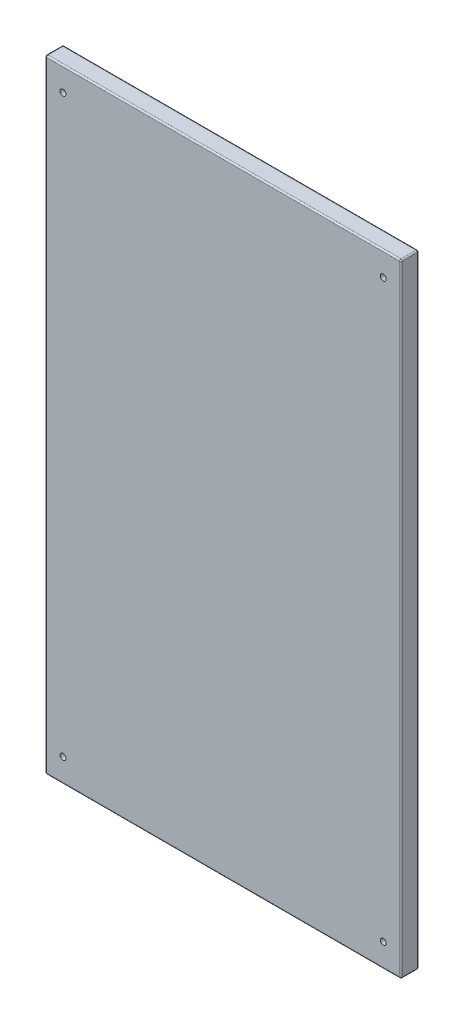
ISO-10303-21;
HEADER;
FILE_DESCRIPTION(('STEP AP214'),'2;1');
FILE_NAME('part.step','',(''),(''),'','','');
FILE_SCHEMA(('AUTOMOTIVE_DESIGN { 1 0 10303 214 1 1 1 1 }'));
ENDSEC;
DATA;
#1=APPLICATION_CONTEXT('core data for automotive mechanical design processes');
#2=APPLICATION_PROTOCOL_DEFINITION('international standard','automotive_design',2000,#1);
#3=PRODUCT_CONTEXT('',#1,'mechanical');
#4=PRODUCT('Part','Part','',(#3));
#5=PRODUCT_RELATED_PRODUCT_CATEGORY('part','',(#4));
#6=PRODUCT_DEFINITION_FORMATION('','',#4);
#7=PRODUCT_DEFINITION_CONTEXT('part definition',#1,'design');
#8=PRODUCT_DEFINITION('design','',#6,#7);
#9=PRODUCT_DEFINITION_SHAPE('','',#8);
#10=(LENGTH_UNIT() NAMED_UNIT(*) SI_UNIT(.MILLI.,.METRE.));
#11=(NAMED_UNIT(*) PLANE_ANGLE_UNIT() SI_UNIT($,.RADIAN.));
#12=(NAMED_UNIT(*) SI_UNIT($,.STERADIAN.) SOLID_ANGLE_UNIT());
#13=UNCERTAINTY_MEASURE_WITH_UNIT(LENGTH_MEASURE(1.E-05),#10,'distance_accuracy_value','');
#14=(GEOMETRIC_REPRESENTATION_CONTEXT(3) GLOBAL_UNCERTAINTY_ASSIGNED_CONTEXT((#13)) GLOBAL_UNIT_ASSIGNED_CONTEXT((#10,
#11,#12)) REPRESENTATION_CONTEXT('',''));
#15=CARTESIAN_POINT('',(0.,0.,0.));
#16=DIRECTION('',(0.,0.,1.));
#17=DIRECTION('',(1.,0.,0.));
#18=AXIS2_PLACEMENT_3D('',#15,#16,#17);
#19=CARTESIAN_POINT('',(-120.,105.,6.));
#20=DIRECTION('',(1.,0.,0.));
#21=DIRECTION('',(0.,0.,-1.));
#22=AXIS2_PLACEMENT_3D('',#19,#20,#21);
#23=PLANE('',#22);
#24=DIRECTION('',(0.,-1.,0.));
#25=VECTOR('',#24,1.);
#26=CARTESIAN_POINT('',(-120.,105.,0.5));
#27=LINE('',#26,#25);
#28=CARTESIAN_POINT('',(-120.,104.5,0.5));
#29=VERTEX_POINT('',#28);
#30=CARTESIAN_POINT('',(-120.,-104.5,0.5));
#31=VERTEX_POINT('',#30);
#32=EDGE_CURVE('E202',#29,#31,#27,.T.);
#33=ORIENTED_EDGE('',*,*,#32,.T.);
#34=DIRECTION('',(0.,0.,-1.));
#35=VECTOR('',#34,1.);
#36=CARTESIAN_POINT('',(-120.,-104.5,6.));
#37=LINE('',#36,#35);
#38=CARTESIAN_POINT('',(-120.,-104.5,5.5));
#39=VERTEX_POINT('',#38);
#40=EDGE_CURVE('E204',#31,#39,#37,.F.);
#41=ORIENTED_EDGE('',*,*,#40,.T.);
#42=DIRECTION('',(0.,-1.,0.));
#43=VECTOR('',#42,1.);
#44=CARTESIAN_POINT('',(-120.,105.,5.5));
#45=LINE('',#44,#43);
#46=CARTESIAN_POINT('',(-120.,104.5,5.5));
#47=VERTEX_POINT('',#46);
#48=EDGE_CURVE('E200',#39,#47,#45,.F.);
#49=ORIENTED_EDGE('',*,*,#48,.T.);
#50=DIRECTION('',(0.,0.,-1.));
#51=VECTOR('',#50,1.);
#52=CARTESIAN_POINT('',(-120.,104.5,6.));
#53=LINE('',#52,#51);
#54=EDGE_CURVE('E198',#47,#29,#53,.T.);
#55=ORIENTED_EDGE('',*,*,#54,.T.);
#56=EDGE_LOOP('',(#33,#41,#49,#55));
#57=FACE_BOUND('',#56,.T.);
#58=ADVANCED_FACE('F36',(#57),#23,.F.);
#59=CARTESIAN_POINT('',(-120.,-105.,6.));
#60=DIRECTION('',(0.,1.,0.));
#61=DIRECTION('',(0.,0.,1.));
#62=AXIS2_PLACEMENT_3D('',#59,#60,#61);
#63=PLANE('',#62);
#64=DIRECTION('',(1.,0.,0.));
#65=VECTOR('',#64,1.);
#66=CARTESIAN_POINT('',(-120.,-105.,0.5));
#67=LINE('',#66,#65);
#68=CARTESIAN_POINT('',(-119.5,-105.,0.5));
#69=VERTEX_POINT('',#68);
#70=CARTESIAN_POINT('',(-0.499999999999986,-105.,0.5));
#71=VERTEX_POINT('',#70);
#72=EDGE_CURVE('E175',#69,#71,#67,.T.);
#73=ORIENTED_EDGE('',*,*,#72,.T.);
#74=DIRECTION('',(0.,0.,-1.));
#75=VECTOR('',#74,1.);
#76=CARTESIAN_POINT('',(-0.499999999999987,-105.,6.));
#77=LINE('',#76,#75);
#78=CARTESIAN_POINT('',(-0.499999999999986,-105.,5.5));
#79=VERTEX_POINT('',#78);
#80=EDGE_CURVE('E177',#71,#79,#77,.F.);
#81=ORIENTED_EDGE('',*,*,#80,.T.);
#82=DIRECTION('',(1.,0.,0.));
#83=VECTOR('',#82,1.);
#84=CARTESIAN_POINT('',(-120.,-105.,5.5));
#85=LINE('',#84,#83);
#86=CARTESIAN_POINT('',(-119.5,-105.,5.5));
#87=VERTEX_POINT('',#86);
#88=EDGE_CURVE('E173',#79,#87,#85,.F.);
#89=ORIENTED_EDGE('',*,*,#88,.T.);
#90=DIRECTION('',(0.,0.,-1.));
#91=VECTOR('',#90,1.);
#92=CARTESIAN_POINT('',(-119.5,-105.,6.));
#93=LINE('',#92,#91);
#94=EDGE_CURVE('E171',#87,#69,#93,.T.);
#95=ORIENTED_EDGE('',*,*,#94,.T.);
#96=EDGE_LOOP('',(#73,#81,#89,#95));
#97=FACE_BOUND('',#96,.T.);
#98=ADVANCED_FACE('F330',(#97),#63,.F.);
#99=CARTESIAN_POINT('',(0.,105.,6.));
#100=DIRECTION('',(-1.,0.,0.));
#101=DIRECTION('',(0.,0.,1.));
#102=AXIS2_PLACEMENT_3D('',#99,#100,#101);
#103=PLANE('',#102);
#104=DIRECTION('',(0.,0.,-1.));
#105=VECTOR('',#104,1.);
#106=CARTESIAN_POINT('',(0.,-104.5,6.));
#107=LINE('',#106,#105);
#108=CARTESIAN_POINT('',(0.,-104.5,5.5));
#109=VERTEX_POINT('',#108);
#110=CARTESIAN_POINT('',(0.,-104.5,0.5));
#111=VERTEX_POINT('',#110);
#112=EDGE_CURVE('E138',#109,#111,#107,.T.);
#113=ORIENTED_EDGE('',*,*,#112,.T.);
#114=DIRECTION('',(0.,1.,0.));
#115=VECTOR('',#114,1.);
#116=CARTESIAN_POINT('',(0.,105.,0.5));
#117=LINE('',#116,#115);
#118=CARTESIAN_POINT('',(0.,104.5,0.5));
#119=VERTEX_POINT('',#118);
#120=EDGE_CURVE('E134',#111,#119,#117,.T.);
#121=ORIENTED_EDGE('',*,*,#120,.T.);
#122=DIRECTION('',(0.,0.,-1.));
#123=VECTOR('',#122,1.);
#124=CARTESIAN_POINT('',(0.,104.5,6.));
#125=LINE('',#124,#123);
#126=CARTESIAN_POINT('',(0.,104.5,5.5));
#127=VERTEX_POINT('',#126);
#128=EDGE_CURVE('E126',#119,#127,#125,.F.);
#129=ORIENTED_EDGE('',*,*,#128,.T.);
#130=DIRECTION('',(0.,1.,0.));
#131=VECTOR('',#130,1.);
#132=CARTESIAN_POINT('',(0.,-105.,5.5));
#133=LINE('',#132,#131);
#134=EDGE_CURVE('E131',#127,#109,#133,.F.);
#135=ORIENTED_EDGE('',*,*,#134,.T.);
#136=EDGE_LOOP('',(#113,#121,#129,#135));
#137=FACE_BOUND('',#136,.T.);
#138=ADVANCED_FACE('F129',(#137),#103,.F.);
#139=CARTESIAN_POINT('',(-120.,105.,6.));
#140=DIRECTION('',(0.,-1.,0.));
#141=DIRECTION('',(0.,0.,-1.));
#142=AXIS2_PLACEMENT_3D('',#139,#140,#141);
#143=PLANE('',#142);
#144=DIRECTION('',(-1.,0.,0.));
#145=VECTOR('',#144,1.);
#146=CARTESIAN_POINT('',(-120.,105.,0.5));
#147=LINE('',#146,#145);
#148=CARTESIAN_POINT('',(-0.499999999999987,105.,0.5));
#149=VERTEX_POINT('',#148);
#150=CARTESIAN_POINT('',(-119.5,105.,0.5));
#151=VERTEX_POINT('',#150);
#152=EDGE_CURVE('E45',#149,#151,#147,.T.);
#153=ORIENTED_EDGE('',*,*,#152,.T.);
#154=DIRECTION('',(0.,0.,-1.));
#155=VECTOR('',#154,1.);
#156=CARTESIAN_POINT('',(-119.5,105.,6.));
#157=LINE('',#156,#155);
#158=CARTESIAN_POINT('',(-119.5,105.,5.5));
#159=VERTEX_POINT('',#158);
#160=EDGE_CURVE('E11',#151,#159,#157,.F.);
#161=ORIENTED_EDGE('',*,*,#160,.T.);
#162=DIRECTION('',(-1.,0.,0.));
#163=VECTOR('',#162,1.);
#164=CARTESIAN_POINT('',(0.,105.,5.5));
#165=LINE('',#164,#163);
#166=CARTESIAN_POINT('',(-0.499999999999987,105.,5.5));
#167=VERTEX_POINT('',#166);
#168=EDGE_CURVE('E59',#159,#167,#165,.F.);
#169=ORIENTED_EDGE('',*,*,#168,.T.);
#170=DIRECTION('',(0.,0.,-1.));
#171=VECTOR('',#170,1.);
#172=CARTESIAN_POINT('',(-0.499999999999987,105.,6.));
#173=LINE('',#172,#171);
#174=EDGE_CURVE('E145',#167,#149,#173,.T.);
#175=ORIENTED_EDGE('',*,*,#174,.T.);
#176=EDGE_LOOP('',(#153,#161,#169,#175));
#177=FACE_BOUND('',#176,.T.);
#178=ADVANCED_FACE('F413',(#177),#143,.F.);
#179=CARTESIAN_POINT('',(0.,0.,6.));
#180=DIRECTION('',(0.,0.,1.));
#181=DIRECTION('',(1.,0.,0.));
#182=AXIS2_PLACEMENT_3D('',#179,#180,#181);
#183=PLANE('',#182);
#184=DIRECTION('',(0.,-1.,0.));
#185=VECTOR('',#184,1.);
#186=CARTESIAN_POINT('',(-119.5,-105.,6.));
#187=LINE('',#186,#185);
#188=CARTESIAN_POINT('',(-119.5,104.5,6.));
#189=VERTEX_POINT('',#188);
#190=CARTESIAN_POINT('',(-119.5,-104.5,6.));
#191=VERTEX_POINT('',#190);
#192=EDGE_CURVE('E193',#189,#191,#187,.T.);
#193=ORIENTED_EDGE('',*,*,#192,.T.);
#194=DIRECTION('',(1.,0.,0.));
#195=VECTOR('',#194,1.);
#196=CARTESIAN_POINT('',(0.,-104.5,6.));
#197=LINE('',#196,#195);
#198=CARTESIAN_POINT('',(-0.499999999999986,-104.5,6.));
#199=VERTEX_POINT('',#198);
#200=EDGE_CURVE('E195',#191,#199,#197,.T.);
#201=ORIENTED_EDGE('',*,*,#200,.T.);
#202=DIRECTION('',(0.,1.,0.));
#203=VECTOR('',#202,1.);
#204=CARTESIAN_POINT('',(-0.499999999999986,105.,6.));
#205=LINE('',#204,#203);
#206=CARTESIAN_POINT('',(-0.499999999999986,104.5,6.));
#207=VERTEX_POINT('',#206);
#208=EDGE_CURVE('E189',#199,#207,#205,.T.);
#209=ORIENTED_EDGE('',*,*,#208,.T.);
#210=DIRECTION('',(-1.,0.,0.));
#211=VECTOR('',#210,1.);
#212=CARTESIAN_POINT('',(-120.,104.5,6.));
#213=LINE('',#212,#211);
#214=EDGE_CURVE('E191',#207,#189,#213,.T.);
#215=ORIENTED_EDGE('',*,*,#214,.T.);
#216=EDGE_LOOP('',(#193,#201,#209,#215));
#217=FACE_BOUND('',#216,.T.);
#218=CARTESIAN_POINT('',(-114.,-97.,6.));
#219=DIRECTION('',(0.,0.,1.));
#220=DIRECTION('',(1.,0.,0.));
#221=AXIS2_PLACEMENT_3D('',#218,#219,#220);
#222=CIRCLE('',#221,0.999999999999998);
#223=CARTESIAN_POINT('',(-113.,-97.,6.));
#224=VERTEX_POINT('',#223);
#225=EDGE_CURVE('E263',#224,#224,#222,.T.);
#226=ORIENTED_EDGE('',*,*,#225,.F.);
#227=EDGE_LOOP('',(#226));
#228=FACE_BOUND('',#227,.T.);
#229=CARTESIAN_POINT('',(-5.99999999999999,-97.,6.));
#230=DIRECTION('',(0.,0.,1.));
#231=DIRECTION('',(1.,0.,0.));
#232=AXIS2_PLACEMENT_3D('',#229,#230,#231);
#233=CIRCLE('',#232,1.);
#234=CARTESIAN_POINT('',(-4.99999999999998,-97.,6.));
#235=VERTEX_POINT('',#234);
#236=EDGE_CURVE('E273',#235,#235,#233,.T.);
#237=ORIENTED_EDGE('',*,*,#236,.F.);
#238=EDGE_LOOP('',(#237));
#239=FACE_BOUND('',#238,.T.);
#240=CARTESIAN_POINT('',(-5.99999999999999,97.,6.));
#241=DIRECTION('',(0.,0.,1.));
#242=DIRECTION('',(1.,0.,0.));
#243=AXIS2_PLACEMENT_3D('',#240,#241,#242);
#244=CIRCLE('',#243,1.);
#245=CARTESIAN_POINT('',(-4.99999999999998,97.,6.));
#246=VERTEX_POINT('',#245);
#247=EDGE_CURVE('E450',#246,#246,#244,.T.);
#248=ORIENTED_EDGE('',*,*,#247,.F.);
#249=EDGE_LOOP('',(#248));
#250=FACE_BOUND('',#249,.T.);
#251=CARTESIAN_POINT('',(-114.,97.,6.));
#252=DIRECTION('',(0.,0.,1.));
#253=DIRECTION('',(1.,0.,0.));
#254=AXIS2_PLACEMENT_3D('',#251,#252,#253);
#255=CIRCLE('',#254,0.999999999999998);
#256=CARTESIAN_POINT('',(-113.,97.,6.));
#257=VERTEX_POINT('',#256);
#258=EDGE_CURVE('E281',#257,#257,#255,.T.);
#259=ORIENTED_EDGE('',*,*,#258,.F.);
#260=EDGE_LOOP('',(#259));
#261=FACE_BOUND('',#260,.T.);
#262=ADVANCED_FACE('F309',(#217,#228,#239,#250,#261),#183,.T.);
#263=CARTESIAN_POINT('',(0.,0.,0.));
#264=DIRECTION('',(0.,0.,1.));
#265=DIRECTION('',(1.,0.,0.));
#266=AXIS2_PLACEMENT_3D('',#263,#264,#265);
#267=PLANE('',#266);
#268=DIRECTION('',(0.,1.,0.));
#269=VECTOR('',#268,1.);
#270=CARTESIAN_POINT('',(-0.499999999999986,0.,0.));
#271=LINE('',#270,#269);
#272=CARTESIAN_POINT('',(-0.499999999999986,104.5,0.));
#273=VERTEX_POINT('',#272);
#274=CARTESIAN_POINT('',(-0.499999999999986,-104.5,0.));
#275=VERTEX_POINT('',#274);
#276=EDGE_CURVE('E180',#273,#275,#271,.F.);
#277=ORIENTED_EDGE('',*,*,#276,.T.);
#278=DIRECTION('',(1.,0.,0.));
#279=VECTOR('',#278,1.);
#280=CARTESIAN_POINT('',(0.,-104.5,0.));
#281=LINE('',#280,#279);
#282=CARTESIAN_POINT('',(-119.5,-104.5,0.));
#283=VERTEX_POINT('',#282);
#284=EDGE_CURVE('E186',#275,#283,#281,.F.);
#285=ORIENTED_EDGE('',*,*,#284,.T.);
#286=DIRECTION('',(0.,-1.,0.));
#287=VECTOR('',#286,1.);
#288=CARTESIAN_POINT('',(-119.5,0.,0.));
#289=LINE('',#288,#287);
#290=CARTESIAN_POINT('',(-119.5,104.5,0.));
#291=VERTEX_POINT('',#290);
#292=EDGE_CURVE('E184',#283,#291,#289,.F.);
#293=ORIENTED_EDGE('',*,*,#292,.T.);
#294=DIRECTION('',(-1.,0.,0.));
#295=VECTOR('',#294,1.);
#296=CARTESIAN_POINT('',(0.,104.5,0.));
#297=LINE('',#296,#295);
#298=EDGE_CURVE('E182',#291,#273,#297,.F.);
#299=ORIENTED_EDGE('',*,*,#298,.T.);
#300=EDGE_LOOP('',(#277,#285,#293,#299));
#301=FACE_BOUND('',#300,.T.);
#302=CARTESIAN_POINT('',(-114.,97.,0.));
#303=DIRECTION('',(0.,0.,-1.));
#304=DIRECTION('',(-1.,0.,0.));
#305=AXIS2_PLACEMENT_3D('',#302,#303,#304);
#306=CIRCLE('',#305,2.);
#307=CARTESIAN_POINT('',(-116.,97.,0.));
#308=VERTEX_POINT('',#307);
#309=EDGE_CURVE('E294',#308,#308,#306,.T.);
#310=ORIENTED_EDGE('',*,*,#309,.F.);
#311=EDGE_LOOP('',(#310));
#312=FACE_BOUND('',#311,.T.);
#313=CARTESIAN_POINT('',(-5.99999999999999,-97.,0.));
#314=DIRECTION('',(0.,0.,-1.));
#315=DIRECTION('',(-1.,0.,0.));
#316=AXIS2_PLACEMENT_3D('',#313,#314,#315);
#317=CIRCLE('',#316,2.);
#318=CARTESIAN_POINT('',(-7.99999999999999,-97.,0.));
#319=VERTEX_POINT('',#318);
#320=EDGE_CURVE('E288',#319,#319,#317,.T.);
#321=ORIENTED_EDGE('',*,*,#320,.F.);
#322=EDGE_LOOP('',(#321));
#323=FACE_BOUND('',#322,.T.);
#324=CARTESIAN_POINT('',(-114.,-97.,0.));
#325=DIRECTION('',(0.,0.,-1.));
#326=DIRECTION('',(-1.,0.,0.));
#327=AXIS2_PLACEMENT_3D('',#324,#325,#326);
#328=CIRCLE('',#327,2.);
#329=CARTESIAN_POINT('',(-116.,-97.,0.));
#330=VERTEX_POINT('',#329);
#331=EDGE_CURVE('E280',#330,#330,#328,.T.);
#332=ORIENTED_EDGE('',*,*,#331,.F.);
#333=EDGE_LOOP('',(#332));
#334=FACE_BOUND('',#333,.T.);
#335=CARTESIAN_POINT('',(-5.99999999999999,97.,0.));
#336=DIRECTION('',(0.,0.,-1.));
#337=DIRECTION('',(-1.,0.,0.));
#338=AXIS2_PLACEMENT_3D('',#335,#336,#337);
#339=CIRCLE('',#338,2.);
#340=CARTESIAN_POINT('',(-7.99999999999999,97.,0.));
#341=VERTEX_POINT('',#340);
#342=EDGE_CURVE('E165',#341,#341,#339,.T.);
#343=ORIENTED_EDGE('',*,*,#342,.F.);
#344=EDGE_LOOP('',(#343));
#345=FACE_BOUND('',#344,.T.);
#346=ADVANCED_FACE('F305',(#301,#312,#323,#334,#345),#267,.F.);
#347=CARTESIAN_POINT('',(-5.99999999999999,97.,3.));
#348=DIRECTION('',(0.,0.,-1.));
#349=DIRECTION('',(-1.,0.,0.));
#350=AXIS2_PLACEMENT_3D('',#347,#348,#349);
#351=CYLINDRICAL_SURFACE('',#350,2.);
#352=CARTESIAN_POINT('',(-5.99999999999999,97.,3.));
#353=DIRECTION('',(0.,0.,-1.));
#354=DIRECTION('',(-1.,0.,0.));
#355=AXIS2_PLACEMENT_3D('',#352,#353,#354);
#356=CIRCLE('',#355,2.);
#357=CARTESIAN_POINT('',(-7.99999999999999,97.,3.));
#358=VERTEX_POINT('',#357);
#359=EDGE_CURVE('E162',#358,#358,#356,.T.);
#360=ORIENTED_EDGE('',*,*,#359,.F.);
#361=EDGE_LOOP('',(#360));
#362=FACE_BOUND('',#361,.T.);
#363=ORIENTED_EDGE('',*,*,#342,.T.);
#364=EDGE_LOOP('',(#363));
#365=FACE_BOUND('',#364,.T.);
#366=ADVANCED_FACE('F308',(#362,#365),#351,.F.);
#367=CARTESIAN_POINT('',(-5.99999999999999,97.,3.));
#368=DIRECTION('',(0.,0.,-1.));
#369=DIRECTION('',(-1.,0.,0.));
#370=AXIS2_PLACEMENT_3D('',#367,#368,#369);
#371=PLANE('',#370);
#372=CARTESIAN_POINT('',(-5.99999999999999,97.,3.));
#373=DIRECTION('',(0.,0.,1.));
#374=DIRECTION('',(1.,0.,0.));
#375=AXIS2_PLACEMENT_3D('',#372,#373,#374);
#376=CIRCLE('',#375,1.);
#377=CARTESIAN_POINT('',(-4.99999999999998,97.,3.));
#378=VERTEX_POINT('',#377);
#379=EDGE_CURVE('E284',#378,#378,#376,.T.);
#380=ORIENTED_EDGE('',*,*,#379,.T.);
#381=EDGE_LOOP('',(#380));
#382=FACE_BOUND('',#381,.T.);
#383=ORIENTED_EDGE('',*,*,#359,.T.);
#384=EDGE_LOOP('',(#383));
#385=FACE_BOUND('',#384,.T.);
#386=ADVANCED_FACE('F318',(#382,#385),#371,.T.);
#387=CARTESIAN_POINT('',(-114.,-97.,3.));
#388=DIRECTION('',(0.,0.,-1.));
#389=DIRECTION('',(-1.,0.,0.));
#390=AXIS2_PLACEMENT_3D('',#387,#388,#389);
#391=CYLINDRICAL_SURFACE('',#390,2.);
#392=CARTESIAN_POINT('',(-114.,-97.,3.));
#393=DIRECTION('',(0.,0.,-1.));
#394=DIRECTION('',(-1.,0.,0.));
#395=AXIS2_PLACEMENT_3D('',#392,#393,#394);
#396=CIRCLE('',#395,2.);
#397=CARTESIAN_POINT('',(-116.,-97.,3.));
#398=VERTEX_POINT('',#397);
#399=EDGE_CURVE('E285',#398,#398,#396,.T.);
#400=ORIENTED_EDGE('',*,*,#399,.F.);
#401=EDGE_LOOP('',(#400));
#402=FACE_BOUND('',#401,.T.);
#403=ORIENTED_EDGE('',*,*,#331,.T.);
#404=EDGE_LOOP('',(#403));
#405=FACE_BOUND('',#404,.T.);
#406=ADVANCED_FACE('F324',(#402,#405),#391,.F.);
#407=CARTESIAN_POINT('',(-114.,-97.,3.));
#408=DIRECTION('',(0.,0.,-1.));
#409=DIRECTION('',(-1.,0.,0.));
#410=AXIS2_PLACEMENT_3D('',#407,#408,#409);
#411=PLANE('',#410);
#412=CARTESIAN_POINT('',(-114.,-97.,3.));
#413=DIRECTION('',(0.,0.,1.));
#414=DIRECTION('',(1.,0.,0.));
#415=AXIS2_PLACEMENT_3D('',#412,#413,#414);
#416=CIRCLE('',#415,0.999999999999998);
#417=CARTESIAN_POINT('',(-113.,-97.,3.));
#418=VERTEX_POINT('',#417);
#419=EDGE_CURVE('E268',#418,#418,#416,.T.);
#420=ORIENTED_EDGE('',*,*,#419,.T.);
#421=EDGE_LOOP('',(#420));
#422=FACE_BOUND('',#421,.T.);
#423=ORIENTED_EDGE('',*,*,#399,.T.);
#424=EDGE_LOOP('',(#423));
#425=FACE_BOUND('',#424,.T.);
#426=ADVANCED_FACE('F473',(#422,#425),#411,.T.);
#427=CARTESIAN_POINT('',(-5.99999999999999,-97.,3.));
#428=DIRECTION('',(0.,0.,-1.));
#429=DIRECTION('',(-1.,0.,0.));
#430=AXIS2_PLACEMENT_3D('',#427,#428,#429);
#431=CYLINDRICAL_SURFACE('',#430,2.);
#432=CARTESIAN_POINT('',(-5.99999999999999,-97.,3.));
#433=DIRECTION('',(0.,0.,-1.));
#434=DIRECTION('',(-1.,0.,0.));
#435=AXIS2_PLACEMENT_3D('',#432,#433,#434);
#436=CIRCLE('',#435,2.);
#437=CARTESIAN_POINT('',(-7.99999999999999,-97.,3.));
#438=VERTEX_POINT('',#437);
#439=EDGE_CURVE('E297',#438,#438,#436,.T.);
#440=ORIENTED_EDGE('',*,*,#439,.F.);
#441=EDGE_LOOP('',(#440));
#442=FACE_BOUND('',#441,.T.);
#443=ORIENTED_EDGE('',*,*,#320,.T.);
#444=EDGE_LOOP('',(#443));
#445=FACE_BOUND('',#444,.T.);
#446=ADVANCED_FACE('F303',(#442,#445),#431,.F.);
#447=CARTESIAN_POINT('',(-5.99999999999999,-97.,3.));
#448=DIRECTION('',(0.,0.,-1.));
#449=DIRECTION('',(-1.,0.,0.));
#450=AXIS2_PLACEMENT_3D('',#447,#448,#449);
#451=PLANE('',#450);
#452=CARTESIAN_POINT('',(-5.99999999999999,-97.,3.));
#453=DIRECTION('',(0.,0.,1.));
#454=DIRECTION('',(1.,0.,0.));
#455=AXIS2_PLACEMENT_3D('',#452,#453,#454);
#456=CIRCLE('',#455,1.);
#457=CARTESIAN_POINT('',(-4.99999999999998,-97.,3.));
#458=VERTEX_POINT('',#457);
#459=EDGE_CURVE('E725',#458,#458,#456,.T.);
#460=ORIENTED_EDGE('',*,*,#459,.T.);
#461=EDGE_LOOP('',(#460));
#462=FACE_BOUND('',#461,.T.);
#463=ORIENTED_EDGE('',*,*,#439,.T.);
#464=EDGE_LOOP('',(#463));
#465=FACE_BOUND('',#464,.T.);
#466=ADVANCED_FACE('F482',(#462,#465),#451,.T.);
#467=CARTESIAN_POINT('',(-114.,97.,3.));
#468=DIRECTION('',(0.,0.,-1.));
#469=DIRECTION('',(-1.,0.,0.));
#470=AXIS2_PLACEMENT_3D('',#467,#468,#469);
#471=CYLINDRICAL_SURFACE('',#470,2.);
#472=CARTESIAN_POINT('',(-114.,97.,3.));
#473=DIRECTION('',(0.,0.,-1.));
#474=DIRECTION('',(-1.,0.,0.));
#475=AXIS2_PLACEMENT_3D('',#472,#473,#474);
#476=CIRCLE('',#475,2.);
#477=CARTESIAN_POINT('',(-116.,97.,3.));
#478=VERTEX_POINT('',#477);
#479=EDGE_CURVE('E291',#478,#478,#476,.T.);
#480=ORIENTED_EDGE('',*,*,#479,.F.);
#481=EDGE_LOOP('',(#480));
#482=FACE_BOUND('',#481,.T.);
#483=ORIENTED_EDGE('',*,*,#309,.T.);
#484=EDGE_LOOP('',(#483));
#485=FACE_BOUND('',#484,.T.);
#486=ADVANCED_FACE('F466',(#482,#485),#471,.F.);
#487=CARTESIAN_POINT('',(-114.,97.,3.));
#488=DIRECTION('',(0.,0.,-1.));
#489=DIRECTION('',(-1.,0.,0.));
#490=AXIS2_PLACEMENT_3D('',#487,#488,#489);
#491=PLANE('',#490);
#492=CARTESIAN_POINT('',(-114.,97.,3.));
#493=DIRECTION('',(0.,0.,1.));
#494=DIRECTION('',(1.,0.,0.));
#495=AXIS2_PLACEMENT_3D('',#492,#493,#494);
#496=CIRCLE('',#495,0.999999999999998);
#497=CARTESIAN_POINT('',(-113.,97.,3.));
#498=VERTEX_POINT('',#497);
#499=EDGE_CURVE('E277',#498,#498,#496,.T.);
#500=ORIENTED_EDGE('',*,*,#499,.T.);
#501=EDGE_LOOP('',(#500));
#502=FACE_BOUND('',#501,.T.);
#503=ORIENTED_EDGE('',*,*,#479,.T.);
#504=EDGE_LOOP('',(#503));
#505=FACE_BOUND('',#504,.T.);
#506=ADVANCED_FACE('F456',(#502,#505),#491,.T.);
#507=CARTESIAN_POINT('',(-114.,97.,3.));
#508=DIRECTION('',(0.,0.,1.));
#509=DIRECTION('',(1.,0.,0.));
#510=AXIS2_PLACEMENT_3D('',#507,#508,#509);
#511=CYLINDRICAL_SURFACE('',#510,0.999999999999998);
#512=ORIENTED_EDGE('',*,*,#499,.F.);
#513=EDGE_LOOP('',(#512));
#514=FACE_BOUND('',#513,.T.);
#515=ORIENTED_EDGE('',*,*,#258,.T.);
#516=EDGE_LOOP('',(#515));
#517=FACE_BOUND('',#516,.T.);
#518=ADVANCED_FACE('F453',(#514,#517),#511,.F.);
#519=CARTESIAN_POINT('',(-5.99999999999999,97.,3.));
#520=DIRECTION('',(0.,0.,1.));
#521=DIRECTION('',(1.,0.,0.));
#522=AXIS2_PLACEMENT_3D('',#519,#520,#521);
#523=CYLINDRICAL_SURFACE('',#522,1.);
#524=ORIENTED_EDGE('',*,*,#379,.F.);
#525=EDGE_LOOP('',(#524));
#526=FACE_BOUND('',#525,.T.);
#527=ORIENTED_EDGE('',*,*,#247,.T.);
#528=EDGE_LOOP('',(#527));
#529=FACE_BOUND('',#528,.T.);
#530=ADVANCED_FACE('F455',(#526,#529),#523,.F.);
#531=CARTESIAN_POINT('',(-5.99999999999999,-97.,3.));
#532=DIRECTION('',(0.,0.,1.));
#533=DIRECTION('',(1.,0.,0.));
#534=AXIS2_PLACEMENT_3D('',#531,#532,#533);
#535=CYLINDRICAL_SURFACE('',#534,1.);
#536=ORIENTED_EDGE('',*,*,#459,.F.);
#537=EDGE_LOOP('',(#536));
#538=FACE_BOUND('',#537,.T.);
#539=ORIENTED_EDGE('',*,*,#236,.T.);
#540=EDGE_LOOP('',(#539));
#541=FACE_BOUND('',#540,.T.);
#542=ADVANCED_FACE('F463',(#538,#541),#535,.F.);
#543=CARTESIAN_POINT('',(-114.,-97.,3.));
#544=DIRECTION('',(0.,0.,1.));
#545=DIRECTION('',(1.,0.,0.));
#546=AXIS2_PLACEMENT_3D('',#543,#544,#545);
#547=CYLINDRICAL_SURFACE('',#546,0.999999999999998);
#548=ORIENTED_EDGE('',*,*,#419,.F.);
#549=EDGE_LOOP('',(#548));
#550=FACE_BOUND('',#549,.T.);
#551=ORIENTED_EDGE('',*,*,#225,.T.);
#552=EDGE_LOOP('',(#551));
#553=FACE_BOUND('',#552,.T.);
#554=ADVANCED_FACE('F408',(#550,#553),#547,.F.);
#555=CARTESIAN_POINT('',(-119.5,104.5,6.));
#556=DIRECTION('',(0.,0.,-1.));
#557=DIRECTION('',(-1.,0.,0.));
#558=AXIS2_PLACEMENT_3D('',#555,#556,#557);
#559=CYLINDRICAL_SURFACE('',#558,0.5);
#560=CARTESIAN_POINT('',(-119.5,104.5,5.5));
#561=DIRECTION('',(0.,0.,1.));
#562=DIRECTION('',(1.,0.,0.));
#563=AXIS2_PLACEMENT_3D('',#560,#561,#562);
#564=CIRCLE('',#563,0.5);
#565=EDGE_CURVE('E40',#159,#47,#564,.T.);
#566=ORIENTED_EDGE('',*,*,#565,.F.);
#567=ORIENTED_EDGE('',*,*,#160,.F.);
#568=CARTESIAN_POINT('',(-119.5,104.5,0.5));
#569=DIRECTION('',(0.,0.,-1.));
#570=DIRECTION('',(-1.,0.,0.));
#571=AXIS2_PLACEMENT_3D('',#568,#569,#570);
#572=CIRCLE('',#571,0.5);
#573=EDGE_CURVE('E256',#29,#151,#572,.T.);
#574=ORIENTED_EDGE('',*,*,#573,.F.);
#575=ORIENTED_EDGE('',*,*,#54,.F.);
#576=EDGE_LOOP('',(#566,#567,#574,#575));
#577=FACE_BOUND('',#576,.T.);
#578=ADVANCED_FACE('F38',(#577),#559,.T.);
#579=CARTESIAN_POINT('',(-119.5,104.5,5.5));
#580=DIRECTION('',(0.,0.,1.));
#581=DIRECTION('',(1.,0.,0.));
#582=AXIS2_PLACEMENT_3D('',#579,#580,#581);
#583=SPHERICAL_SURFACE('',#582,0.5);
#584=CARTESIAN_POINT('',(-119.5,104.5,5.5));
#585=DIRECTION('',(-1.,0.,0.));
#586=DIRECTION('',(0.,0.,1.));
#587=AXIS2_PLACEMENT_3D('',#584,#585,#586);
#588=CIRCLE('',#587,0.5);
#589=EDGE_CURVE('E252',#159,#189,#588,.F.);
#590=ORIENTED_EDGE('',*,*,#589,.F.);
#591=ORIENTED_EDGE('',*,*,#565,.T.);
#592=CARTESIAN_POINT('',(-119.5,104.5,5.5));
#593=DIRECTION('',(0.,1.,0.));
#594=DIRECTION('',(0.,0.,1.));
#595=AXIS2_PLACEMENT_3D('',#592,#593,#594);
#596=CIRCLE('',#595,0.5);
#597=EDGE_CURVE('E254',#189,#47,#596,.F.);
#598=ORIENTED_EDGE('',*,*,#597,.F.);
#599=EDGE_LOOP('',(#590,#591,#598));
#600=FACE_BOUND('',#599,.T.);
#601=ADVANCED_FACE('F403',(#600),#583,.T.);
#602=CARTESIAN_POINT('',(-119.5,104.5,0.5));
#603=DIRECTION('',(0.,0.,1.));
#604=DIRECTION('',(1.,0.,0.));
#605=AXIS2_PLACEMENT_3D('',#602,#603,#604);
#606=SPHERICAL_SURFACE('',#605,0.5);
#607=CARTESIAN_POINT('',(-119.5,104.5,0.5));
#608=DIRECTION('',(0.,1.,0.));
#609=DIRECTION('',(0.,0.,1.));
#610=AXIS2_PLACEMENT_3D('',#607,#608,#609);
#611=CIRCLE('',#610,0.5);
#612=EDGE_CURVE('E246',#29,#291,#611,.F.);
#613=ORIENTED_EDGE('',*,*,#612,.F.);
#614=ORIENTED_EDGE('',*,*,#573,.T.);
#615=CARTESIAN_POINT('',(-119.5,104.5,0.5));
#616=DIRECTION('',(-1.,0.,0.));
#617=DIRECTION('',(0.,0.,1.));
#618=AXIS2_PLACEMENT_3D('',#615,#616,#617);
#619=CIRCLE('',#618,0.5);
#620=EDGE_CURVE('E249',#291,#151,#619,.F.);
#621=ORIENTED_EDGE('',*,*,#620,.F.);
#622=EDGE_LOOP('',(#613,#614,#621));
#623=FACE_BOUND('',#622,.T.);
#624=ADVANCED_FACE('F400',(#623),#606,.T.);
#625=CARTESIAN_POINT('',(-119.5,0.,5.5));
#626=DIRECTION('',(0.,1.,0.));
#627=DIRECTION('',(0.,0.,1.));
#628=AXIS2_PLACEMENT_3D('',#625,#626,#627);
#629=CYLINDRICAL_SURFACE('',#628,0.5);
#630=ORIENTED_EDGE('',*,*,#597,.T.);
#631=ORIENTED_EDGE('',*,*,#48,.F.);
#632=CARTESIAN_POINT('',(-119.5,-104.5,5.5));
#633=DIRECTION('',(0.,-1.,0.));
#634=DIRECTION('',(0.,0.,-1.));
#635=AXIS2_PLACEMENT_3D('',#632,#633,#634);
#636=CIRCLE('',#635,0.5);
#637=EDGE_CURVE('E241',#191,#39,#636,.T.);
#638=ORIENTED_EDGE('',*,*,#637,.F.);
#639=ORIENTED_EDGE('',*,*,#192,.F.);
#640=EDGE_LOOP('',(#630,#631,#638,#639));
#641=FACE_BOUND('',#640,.T.);
#642=ADVANCED_FACE('F397',(#641),#629,.T.);
#643=CARTESIAN_POINT('',(0.,104.5,5.5));
#644=DIRECTION('',(1.,0.,0.));
#645=DIRECTION('',(0.,0.,-1.));
#646=AXIS2_PLACEMENT_3D('',#643,#644,#645);
#647=CYLINDRICAL_SURFACE('',#646,0.5);
#648=ORIENTED_EDGE('',*,*,#589,.T.);
#649=ORIENTED_EDGE('',*,*,#214,.F.);
#650=CARTESIAN_POINT('',(-0.499999999999987,104.5,5.5));
#651=DIRECTION('',(1.,0.,0.));
#652=DIRECTION('',(0.,0.,-1.));
#653=AXIS2_PLACEMENT_3D('',#650,#651,#652);
#654=CIRCLE('',#653,0.5);
#655=EDGE_CURVE('E148',#167,#207,#654,.T.);
#656=ORIENTED_EDGE('',*,*,#655,.F.);
#657=ORIENTED_EDGE('',*,*,#168,.F.);
#658=EDGE_LOOP('',(#648,#649,#656,#657));
#659=FACE_BOUND('',#658,.T.);
#660=ADVANCED_FACE('F394',(#659),#647,.T.);
#661=CARTESIAN_POINT('',(-0.499999999999987,104.5,6.));
#662=DIRECTION('',(0.,0.,-1.));
#663=DIRECTION('',(-1.,0.,0.));
#664=AXIS2_PLACEMENT_3D('',#661,#662,#663);
#665=CYLINDRICAL_SURFACE('',#664,0.5);
#666=CARTESIAN_POINT('',(-0.499999999999987,104.5,0.5));
#667=DIRECTION('',(0.,0.,-1.));
#668=DIRECTION('',(-1.,0.,0.));
#669=AXIS2_PLACEMENT_3D('',#666,#667,#668);
#670=CIRCLE('',#669,0.5);
#671=EDGE_CURVE('E149',#149,#119,#670,.T.);
#672=ORIENTED_EDGE('',*,*,#671,.F.);
#673=ORIENTED_EDGE('',*,*,#174,.F.);
#674=CARTESIAN_POINT('',(-0.499999999999986,104.5,5.5));
#675=DIRECTION('',(0.,0.,1.));
#676=DIRECTION('',(1.,0.,0.));
#677=AXIS2_PLACEMENT_3D('',#674,#675,#676);
#678=CIRCLE('',#677,0.5);
#679=EDGE_CURVE('E142',#127,#167,#678,.T.);
#680=ORIENTED_EDGE('',*,*,#679,.F.);
#681=ORIENTED_EDGE('',*,*,#128,.F.);
#682=EDGE_LOOP('',(#672,#673,#680,#681));
#683=FACE_BOUND('',#682,.T.);
#684=ADVANCED_FACE('F144',(#683),#665,.T.);
#685=CARTESIAN_POINT('',(-120.,104.5,0.5));
#686=DIRECTION('',(-1.,0.,0.));
#687=DIRECTION('',(0.,0.,1.));
#688=AXIS2_PLACEMENT_3D('',#685,#686,#687);
#689=CYLINDRICAL_SURFACE('',#688,0.5);
#690=ORIENTED_EDGE('',*,*,#620,.T.);
#691=ORIENTED_EDGE('',*,*,#152,.F.);
#692=CARTESIAN_POINT('',(-0.499999999999986,104.5,0.5));
#693=DIRECTION('',(1.,0.,0.));
#694=DIRECTION('',(0.,1.,0.));
#695=AXIS2_PLACEMENT_3D('',#692,#693,#694);
#696=CIRCLE('',#695,0.5);
#697=EDGE_CURVE('E236',#273,#149,#696,.T.);
#698=ORIENTED_EDGE('',*,*,#697,.F.);
#699=ORIENTED_EDGE('',*,*,#298,.F.);
#700=EDGE_LOOP('',(#690,#691,#698,#699));
#701=FACE_BOUND('',#700,.T.);
#702=ADVANCED_FACE('F387',(#701),#689,.T.);
#703=CARTESIAN_POINT('',(-119.5,105.,0.5));
#704=DIRECTION('',(0.,-1.,0.));
#705=DIRECTION('',(0.,0.,-1.));
#706=AXIS2_PLACEMENT_3D('',#703,#704,#705);
#707=CYLINDRICAL_SURFACE('',#706,0.5);
#708=ORIENTED_EDGE('',*,*,#612,.T.);
#709=ORIENTED_EDGE('',*,*,#292,.F.);
#710=CARTESIAN_POINT('',(-119.5,-104.5,0.5));
#711=DIRECTION('',(0.,-1.,0.));
#712=DIRECTION('',(0.,0.,-1.));
#713=AXIS2_PLACEMENT_3D('',#710,#711,#712);
#714=CIRCLE('',#713,0.5);
#715=EDGE_CURVE('E233',#31,#283,#714,.T.);
#716=ORIENTED_EDGE('',*,*,#715,.F.);
#717=ORIENTED_EDGE('',*,*,#32,.F.);
#718=EDGE_LOOP('',(#708,#709,#716,#717));
#719=FACE_BOUND('',#718,.T.);
#720=ADVANCED_FACE('F383',(#719),#707,.T.);
#721=CARTESIAN_POINT('',(-119.5,-104.5,6.));
#722=DIRECTION('',(0.,0.,-1.));
#723=DIRECTION('',(-1.,0.,0.));
#724=AXIS2_PLACEMENT_3D('',#721,#722,#723);
#725=CYLINDRICAL_SURFACE('',#724,0.5);
#726=CARTESIAN_POINT('',(-119.5,-104.5,5.5));
#727=DIRECTION('',(0.,0.,1.));
#728=DIRECTION('',(1.,0.,0.));
#729=AXIS2_PLACEMENT_3D('',#726,#727,#728);
#730=CIRCLE('',#729,0.5);
#731=EDGE_CURVE('E243',#39,#87,#730,.T.);
#732=ORIENTED_EDGE('',*,*,#731,.F.);
#733=ORIENTED_EDGE('',*,*,#40,.F.);
#734=CARTESIAN_POINT('',(-119.5,-104.5,0.5));
#735=DIRECTION('',(0.,0.,-1.));
#736=DIRECTION('',(-1.,0.,0.));
#737=AXIS2_PLACEMENT_3D('',#734,#735,#736);
#738=CIRCLE('',#737,0.5);
#739=EDGE_CURVE('E230',#69,#31,#738,.T.);
#740=ORIENTED_EDGE('',*,*,#739,.F.);
#741=ORIENTED_EDGE('',*,*,#94,.F.);
#742=EDGE_LOOP('',(#732,#733,#740,#741));
#743=FACE_BOUND('',#742,.T.);
#744=ADVANCED_FACE('F379',(#743),#725,.T.);
#745=CARTESIAN_POINT('',(-119.5,-104.5,5.5));
#746=DIRECTION('',(0.,0.,1.));
#747=DIRECTION('',(1.,0.,0.));
#748=AXIS2_PLACEMENT_3D('',#745,#746,#747);
#749=SPHERICAL_SURFACE('',#748,0.5);
#750=ORIENTED_EDGE('',*,*,#637,.T.);
#751=ORIENTED_EDGE('',*,*,#731,.T.);
#752=CARTESIAN_POINT('',(-119.5,-104.5,5.5));
#753=DIRECTION('',(-1.,0.,0.));
#754=DIRECTION('',(0.,0.,1.));
#755=AXIS2_PLACEMENT_3D('',#752,#753,#754);
#756=CIRCLE('',#755,0.5);
#757=EDGE_CURVE('E156',#191,#87,#756,.F.);
#758=ORIENTED_EDGE('',*,*,#757,.F.);
#759=EDGE_LOOP('',(#750,#751,#758));
#760=FACE_BOUND('',#759,.T.);
#761=ADVANCED_FACE('F376',(#760),#749,.T.);
#762=CARTESIAN_POINT('',(-0.499999999999986,104.5,5.5));
#763=DIRECTION('',(0.,0.,1.));
#764=DIRECTION('',(1.,0.,0.));
#765=AXIS2_PLACEMENT_3D('',#762,#763,#764);
#766=SPHERICAL_SURFACE('',#765,0.5);
#767=ORIENTED_EDGE('',*,*,#679,.T.);
#768=ORIENTED_EDGE('',*,*,#655,.T.);
#769=CARTESIAN_POINT('',(-0.499999999999986,104.5,5.5));
#770=DIRECTION('',(0.,1.,0.));
#771=DIRECTION('',(0.,0.,1.));
#772=AXIS2_PLACEMENT_3D('',#769,#770,#771);
#773=CIRCLE('',#772,0.5);
#774=EDGE_CURVE('E152',#127,#207,#773,.F.);
#775=ORIENTED_EDGE('',*,*,#774,.F.);
#776=EDGE_LOOP('',(#767,#768,#775));
#777=FACE_BOUND('',#776,.T.);
#778=ADVANCED_FACE('F153',(#777),#766,.T.);
#779=CARTESIAN_POINT('',(-0.499999999999986,104.5,0.5));
#780=DIRECTION('',(0.,0.,1.));
#781=DIRECTION('',(1.,0.,0.));
#782=AXIS2_PLACEMENT_3D('',#779,#780,#781);
#783=SPHERICAL_SURFACE('',#782,0.5);
#784=ORIENTED_EDGE('',*,*,#697,.T.);
#785=ORIENTED_EDGE('',*,*,#671,.T.);
#786=CARTESIAN_POINT('',(-0.499999999999986,104.5,0.5));
#787=DIRECTION('',(0.,1.,0.));
#788=DIRECTION('',(0.,0.,1.));
#789=AXIS2_PLACEMENT_3D('',#786,#787,#788);
#790=CIRCLE('',#789,0.5);
#791=EDGE_CURVE('E157',#273,#119,#790,.F.);
#792=ORIENTED_EDGE('',*,*,#791,.F.);
#793=EDGE_LOOP('',(#784,#785,#792));
#794=FACE_BOUND('',#793,.T.);
#795=ADVANCED_FACE('F369',(#794),#783,.T.);
#796=CARTESIAN_POINT('',(-119.5,-104.5,0.5));
#797=DIRECTION('',(0.,0.,1.));
#798=DIRECTION('',(1.,0.,0.));
#799=AXIS2_PLACEMENT_3D('',#796,#797,#798);
#800=SPHERICAL_SURFACE('',#799,0.5);
#801=ORIENTED_EDGE('',*,*,#739,.T.);
#802=ORIENTED_EDGE('',*,*,#715,.T.);
#803=CARTESIAN_POINT('',(-119.5,-104.5,0.5));
#804=DIRECTION('',(-1.,0.,0.));
#805=DIRECTION('',(0.,0.,1.));
#806=AXIS2_PLACEMENT_3D('',#803,#804,#805);
#807=CIRCLE('',#806,0.5);
#808=EDGE_CURVE('E224',#69,#283,#807,.F.);
#809=ORIENTED_EDGE('',*,*,#808,.F.);
#810=EDGE_LOOP('',(#801,#802,#809));
#811=FACE_BOUND('',#810,.T.);
#812=ADVANCED_FACE('F365',(#811),#800,.T.);
#813=CARTESIAN_POINT('',(0.,-104.5,5.5));
#814=DIRECTION('',(-1.,0.,0.));
#815=DIRECTION('',(0.,0.,1.));
#816=AXIS2_PLACEMENT_3D('',#813,#814,#815);
#817=CYLINDRICAL_SURFACE('',#816,0.5);
#818=ORIENTED_EDGE('',*,*,#757,.T.);
#819=ORIENTED_EDGE('',*,*,#88,.F.);
#820=CARTESIAN_POINT('',(-0.499999999999986,-104.5,5.5));
#821=DIRECTION('',(1.,0.,0.));
#822=DIRECTION('',(0.,0.,-1.));
#823=AXIS2_PLACEMENT_3D('',#820,#821,#822);
#824=CIRCLE('',#823,0.5);
#825=EDGE_CURVE('E221',#199,#79,#824,.T.);
#826=ORIENTED_EDGE('',*,*,#825,.F.);
#827=ORIENTED_EDGE('',*,*,#200,.F.);
#828=EDGE_LOOP('',(#818,#819,#826,#827));
#829=FACE_BOUND('',#828,.T.);
#830=ADVANCED_FACE('F362',(#829),#817,.T.);
#831=CARTESIAN_POINT('',(-0.499999999999986,0.,5.5));
#832=DIRECTION('',(0.,-1.,0.));
#833=DIRECTION('',(0.,0.,-1.));
#834=AXIS2_PLACEMENT_3D('',#831,#832,#833);
#835=CYLINDRICAL_SURFACE('',#834,0.5);
#836=ORIENTED_EDGE('',*,*,#774,.T.);
#837=ORIENTED_EDGE('',*,*,#208,.F.);
#838=CARTESIAN_POINT('',(-0.499999999999986,-104.5,5.5));
#839=DIRECTION('',(0.,-1.,0.));
#840=DIRECTION('',(0.,0.,-1.));
#841=AXIS2_PLACEMENT_3D('',#838,#839,#840);
#842=CIRCLE('',#841,0.5);
#843=EDGE_CURVE('E160',#109,#199,#842,.T.);
#844=ORIENTED_EDGE('',*,*,#843,.F.);
#845=ORIENTED_EDGE('',*,*,#134,.F.);
#846=EDGE_LOOP('',(#836,#837,#844,#845));
#847=FACE_BOUND('',#846,.T.);
#848=ADVANCED_FACE('F159',(#847),#835,.T.);
#849=CARTESIAN_POINT('',(-0.499999999999986,105.,0.5));
#850=DIRECTION('',(0.,1.,0.));
#851=DIRECTION('',(0.,0.,1.));
#852=AXIS2_PLACEMENT_3D('',#849,#850,#851);
#853=CYLINDRICAL_SURFACE('',#852,0.5);
#854=ORIENTED_EDGE('',*,*,#791,.T.);
#855=ORIENTED_EDGE('',*,*,#120,.F.);
#856=CARTESIAN_POINT('',(-0.499999999999986,-104.5,0.5));
#857=DIRECTION('',(0.,-1.,0.));
#858=DIRECTION('',(0.,0.,-1.));
#859=AXIS2_PLACEMENT_3D('',#856,#857,#858);
#860=CIRCLE('',#859,0.5);
#861=EDGE_CURVE('E217',#275,#111,#860,.T.);
#862=ORIENTED_EDGE('',*,*,#861,.F.);
#863=ORIENTED_EDGE('',*,*,#276,.F.);
#864=EDGE_LOOP('',(#854,#855,#862,#863));
#865=FACE_BOUND('',#864,.T.);
#866=ADVANCED_FACE('F355',(#865),#853,.T.);
#867=CARTESIAN_POINT('',(-120.,-104.5,0.5));
#868=DIRECTION('',(1.,0.,0.));
#869=DIRECTION('',(0.,0.,-1.));
#870=AXIS2_PLACEMENT_3D('',#867,#868,#869);
#871=CYLINDRICAL_SURFACE('',#870,0.5);
#872=ORIENTED_EDGE('',*,*,#808,.T.);
#873=ORIENTED_EDGE('',*,*,#284,.F.);
#874=CARTESIAN_POINT('',(-0.499999999999986,-104.5,0.5));
#875=DIRECTION('',(1.,0.,0.));
#876=DIRECTION('',(0.,0.,-1.));
#877=AXIS2_PLACEMENT_3D('',#874,#875,#876);
#878=CIRCLE('',#877,0.5);
#879=EDGE_CURVE('E214',#71,#275,#878,.T.);
#880=ORIENTED_EDGE('',*,*,#879,.F.);
#881=ORIENTED_EDGE('',*,*,#72,.F.);
#882=EDGE_LOOP('',(#872,#873,#880,#881));
#883=FACE_BOUND('',#882,.T.);
#884=ADVANCED_FACE('F351',(#883),#871,.T.);
#885=CARTESIAN_POINT('',(-0.499999999999986,-104.5,5.5));
#886=DIRECTION('',(0.,0.,1.));
#887=DIRECTION('',(1.,0.,0.));
#888=AXIS2_PLACEMENT_3D('',#885,#886,#887);
#889=SPHERICAL_SURFACE('',#888,0.5);
#890=ORIENTED_EDGE('',*,*,#843,.T.);
#891=ORIENTED_EDGE('',*,*,#825,.T.);
#892=CARTESIAN_POINT('',(-0.499999999999986,-104.5,5.5));
#893=DIRECTION('',(0.,0.,1.));
#894=DIRECTION('',(1.,0.,0.));
#895=AXIS2_PLACEMENT_3D('',#892,#893,#894);
#896=CIRCLE('',#895,0.5);
#897=EDGE_CURVE('E212',#109,#79,#896,.F.);
#898=ORIENTED_EDGE('',*,*,#897,.F.);
#899=EDGE_LOOP('',(#890,#891,#898));
#900=FACE_BOUND('',#899,.T.);
#901=ADVANCED_FACE('F347',(#900),#889,.T.);
#902=CARTESIAN_POINT('',(-0.499999999999986,-104.5,0.5));
#903=DIRECTION('',(0.,0.,1.));
#904=DIRECTION('',(1.,0.,0.));
#905=AXIS2_PLACEMENT_3D('',#902,#903,#904);
#906=SPHERICAL_SURFACE('',#905,0.5);
#907=ORIENTED_EDGE('',*,*,#879,.T.);
#908=ORIENTED_EDGE('',*,*,#861,.T.);
#909=CARTESIAN_POINT('',(-0.499999999999986,-104.5,0.5));
#910=DIRECTION('',(0.,0.,-1.));
#911=DIRECTION('',(-1.,0.,0.));
#912=AXIS2_PLACEMENT_3D('',#909,#910,#911);
#913=CIRCLE('',#912,0.5);
#914=EDGE_CURVE('E210',#71,#111,#913,.F.);
#915=ORIENTED_EDGE('',*,*,#914,.F.);
#916=EDGE_LOOP('',(#907,#908,#915));
#917=FACE_BOUND('',#916,.T.);
#918=ADVANCED_FACE('F343',(#917),#906,.T.);
#919=CARTESIAN_POINT('',(-0.499999999999986,-104.5,6.));
#920=DIRECTION('',(0.,0.,-1.));
#921=DIRECTION('',(-1.,0.,0.));
#922=AXIS2_PLACEMENT_3D('',#919,#920,#921);
#923=CYLINDRICAL_SURFACE('',#922,0.5);
#924=ORIENTED_EDGE('',*,*,#897,.T.);
#925=ORIENTED_EDGE('',*,*,#80,.F.);
#926=ORIENTED_EDGE('',*,*,#914,.T.);
#927=ORIENTED_EDGE('',*,*,#112,.F.);
#928=EDGE_LOOP('',(#924,#925,#926,#927));
#929=FACE_BOUND('',#928,.T.);
#930=ADVANCED_FACE('F340',(#929),#923,.T.);
#931=CLOSED_SHELL('',(#58,#98,#138,#178,#262,#346,#366,#386,#406,#426,#446,#466,#486,#506,#518,
#530,#542,#554,#578,#601,#624,#642,#660,#684,#702,#720,#744,#761,#778,#795,#812,#830,#848,#866,
#884,#901,#918,#930));
#932=MANIFOLD_SOLID_BREP('B2',#931);
#933=ADVANCED_BREP_SHAPE_REPRESENTATION('',(#18,#932),#14);
#934=SHAPE_DEFINITION_REPRESENTATION(#9,#933);
ENDSEC;
END-ISO-10303-21;
